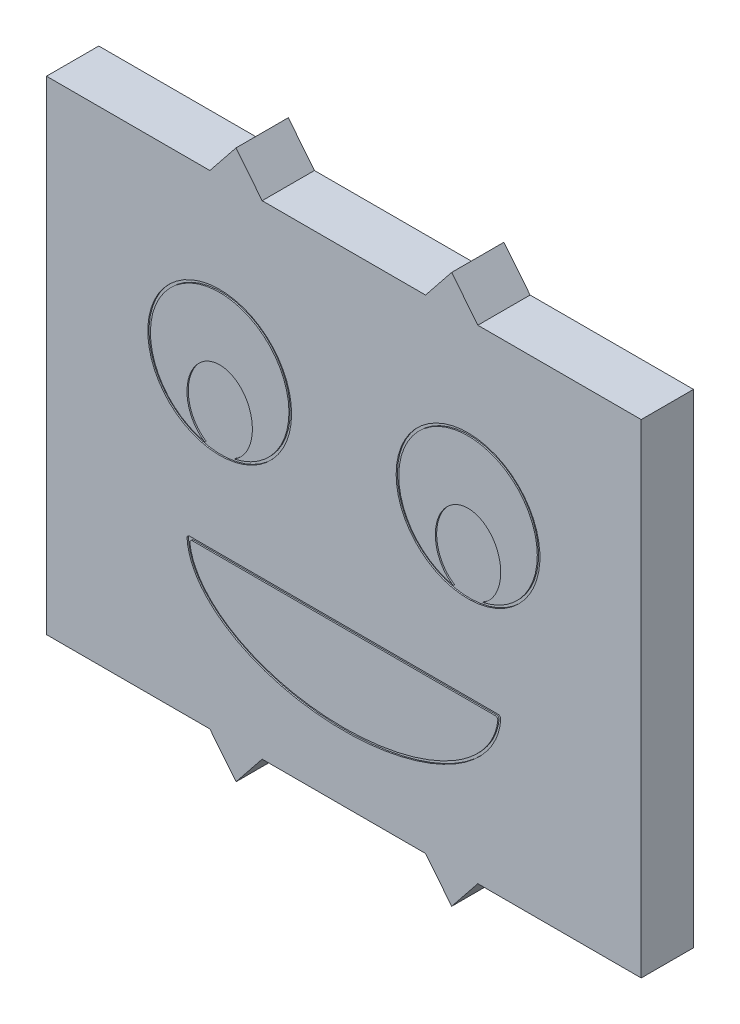
ISO-10303-21;
HEADER;
FILE_DESCRIPTION(('STEP AP214'),'2;1');
FILE_NAME('part.step','',(''),(''),'','','');
FILE_SCHEMA(('AUTOMOTIVE_DESIGN { 1 0 10303 214 1 1 1 1 }'));
ENDSEC;
DATA;
#1=APPLICATION_CONTEXT('core data for automotive mechanical design processes');
#2=APPLICATION_PROTOCOL_DEFINITION('international standard','automotive_design',2000,#1);
#3=PRODUCT_CONTEXT('',#1,'mechanical');
#4=PRODUCT('Part','Part','',(#3));
#5=PRODUCT_RELATED_PRODUCT_CATEGORY('part','',(#4));
#6=PRODUCT_DEFINITION_FORMATION('','',#4);
#7=PRODUCT_DEFINITION_CONTEXT('part definition',#1,'design');
#8=PRODUCT_DEFINITION('design','',#6,#7);
#9=PRODUCT_DEFINITION_SHAPE('','',#8);
#10=(LENGTH_UNIT() NAMED_UNIT(*) SI_UNIT(.MILLI.,.METRE.));
#11=(NAMED_UNIT(*) PLANE_ANGLE_UNIT() SI_UNIT($,.RADIAN.));
#12=(NAMED_UNIT(*) SI_UNIT($,.STERADIAN.) SOLID_ANGLE_UNIT());
#13=UNCERTAINTY_MEASURE_WITH_UNIT(LENGTH_MEASURE(1.E-05),#10,'distance_accuracy_value','');
#14=(GEOMETRIC_REPRESENTATION_CONTEXT(3) GLOBAL_UNCERTAINTY_ASSIGNED_CONTEXT((#13)) GLOBAL_UNIT_ASSIGNED_CONTEXT((#10,
#11,#12)) REPRESENTATION_CONTEXT('',''));
#15=CARTESIAN_POINT('',(0.,0.,0.));
#16=DIRECTION('',(0.,0.,1.));
#17=DIRECTION('',(1.,0.,0.));
#18=AXIS2_PLACEMENT_3D('',#15,#16,#17);
#19=CARTESIAN_POINT('',(0.,0.,4.));
#20=DIRECTION('',(0.,0.,1.));
#21=DIRECTION('',(1.,0.,0.));
#22=AXIS2_PLACEMENT_3D('',#19,#20,#21);
#23=PLANE('',#22);
#24=CARTESIAN_POINT('',(32.25,24.,4.));
#25=DIRECTION('',(0.,0.,-1.));
#26=DIRECTION('',(-1.,0.,0.));
#27=AXIS2_PLACEMENT_3D('',#24,#25,#26);
#28=CIRCLE('',#27,5.5);
#29=CARTESIAN_POINT('',(26.75,24.,4.));
#30=VERTEX_POINT('',#29);
#31=EDGE_CURVE('E250',#30,#30,#28,.T.);
#32=ORIENTED_EDGE('',*,*,#31,.T.);
#33=EDGE_LOOP('',(#32));
#34=FACE_BOUND('',#33,.T.);
#35=CARTESIAN_POINT('',(13.25,24.,4.));
#36=DIRECTION('',(0.,0.,1.));
#37=DIRECTION('',(1.,0.,0.));
#38=AXIS2_PLACEMENT_3D('',#35,#36,#37);
#39=CIRCLE('',#38,5.5);
#40=CARTESIAN_POINT('',(18.75,24.,4.));
#41=VERTEX_POINT('',#40);
#42=EDGE_CURVE('E275',#41,#41,#39,.T.);
#43=ORIENTED_EDGE('',*,*,#42,.F.);
#44=EDGE_LOOP('',(#43));
#45=FACE_BOUND('',#44,.T.);
#46=DIRECTION('',(1.,0.,0.));
#47=VECTOR('',#46,1.);
#48=CARTESIAN_POINT('',(0.,0.,4.));
#49=LINE('',#48,#47);
#50=CARTESIAN_POINT('',(0.,0.,4.));
#51=VERTEX_POINT('',#50);
#52=CARTESIAN_POINT('',(12.5,0.,4.));
#53=VERTEX_POINT('',#52);
#54=EDGE_CURVE('E346',#51,#53,#49,.T.);
#55=ORIENTED_EDGE('',*,*,#54,.T.);
#56=DIRECTION('',(0.624695047554424,-0.78086880944303,0.));
#57=VECTOR('',#56,1.);
#58=CARTESIAN_POINT('',(7.6219512195122,6.09756097560976,4.));
#59=LINE('',#58,#57);
#60=CARTESIAN_POINT('',(14.5,-2.5,4.));
#61=VERTEX_POINT('',#60);
#62=EDGE_CURVE('E353',#53,#61,#59,.T.);
#63=ORIENTED_EDGE('',*,*,#62,.T.);
#64=DIRECTION('',(0.624695047554424,0.780868809443031,0.));
#65=VECTOR('',#64,1.);
#66=CARTESIAN_POINT('',(10.0609756097561,-8.04878048780488,4.));
#67=LINE('',#66,#65);
#68=CARTESIAN_POINT('',(16.5,0.,4.));
#69=VERTEX_POINT('',#68);
#70=EDGE_CURVE('E359',#61,#69,#67,.T.);
#71=ORIENTED_EDGE('',*,*,#70,.T.);
#72=CARTESIAN_POINT('',(29.,0.,4.));
#73=VERTEX_POINT('',#72);
#74=EDGE_CURVE('E356',#69,#73,#49,.T.);
#75=ORIENTED_EDGE('',*,*,#74,.T.);
#76=DIRECTION('',(-0.624695047554424,0.78086880944303,0.));
#77=VECTOR('',#76,1.);
#78=CARTESIAN_POINT('',(17.6829268292683,14.1463414634146,4.));
#79=LINE('',#78,#77);
#80=CARTESIAN_POINT('',(31.,-2.5,4.));
#81=VERTEX_POINT('',#80);
#82=EDGE_CURVE('E362',#81,#73,#79,.T.);
#83=ORIENTED_EDGE('',*,*,#82,.F.);
#84=DIRECTION('',(-0.624695047554424,-0.78086880944303,0.));
#85=VECTOR('',#84,1.);
#86=CARTESIAN_POINT('',(20.1219512195122,-16.0975609756098,4.));
#87=LINE('',#86,#85);
#88=CARTESIAN_POINT('',(33.,0.,4.));
#89=VERTEX_POINT('',#88);
#90=EDGE_CURVE('E366',#89,#81,#87,.T.);
#91=ORIENTED_EDGE('',*,*,#90,.F.);
#92=CARTESIAN_POINT('',(45.5,0.,4.));
#93=VERTEX_POINT('',#92);
#94=EDGE_CURVE('E355',#89,#93,#49,.T.);
#95=ORIENTED_EDGE('',*,*,#94,.T.);
#96=DIRECTION('',(0.,1.,0.));
#97=VECTOR('',#96,1.);
#98=CARTESIAN_POINT('',(45.5,0.,4.));
#99=LINE('',#98,#97);
#100=CARTESIAN_POINT('',(45.5,37.,4.));
#101=VERTEX_POINT('',#100);
#102=EDGE_CURVE('E370',#93,#101,#99,.T.);
#103=ORIENTED_EDGE('',*,*,#102,.T.);
#104=DIRECTION('',(1.,0.,0.));
#105=VECTOR('',#104,1.);
#106=CARTESIAN_POINT('',(0.,37.,4.));
#107=LINE('',#106,#105);
#108=CARTESIAN_POINT('',(33.,37.,4.));
#109=VERTEX_POINT('',#108);
#110=EDGE_CURVE('E373',#109,#101,#107,.T.);
#111=ORIENTED_EDGE('',*,*,#110,.F.);
#112=DIRECTION('',(-0.624695047554424,0.78086880944303,0.));
#113=VECTOR('',#112,1.);
#114=CARTESIAN_POINT('',(38.1707317073171,30.5365853658537,4.));
#115=LINE('',#114,#113);
#116=CARTESIAN_POINT('',(31.,39.5,4.));
#117=VERTEX_POINT('',#116);
#118=EDGE_CURVE('E377',#109,#117,#115,.T.);
#119=ORIENTED_EDGE('',*,*,#118,.T.);
#120=DIRECTION('',(-0.624695047554424,-0.78086880944303,0.));
#121=VECTOR('',#120,1.);
#122=CARTESIAN_POINT('',(-0.365853658536584,0.292682926829267,4.));
#123=LINE('',#122,#121);
#124=CARTESIAN_POINT('',(29.,37.,4.));
#125=VERTEX_POINT('',#124);
#126=EDGE_CURVE('E382',#117,#125,#123,.T.);
#127=ORIENTED_EDGE('',*,*,#126,.T.);
#128=CARTESIAN_POINT('',(16.5,37.,4.));
#129=VERTEX_POINT('',#128);
#130=EDGE_CURVE('E379',#129,#125,#107,.T.);
#131=ORIENTED_EDGE('',*,*,#130,.F.);
#132=DIRECTION('',(0.624695047554424,-0.78086880944303,0.));
#133=VECTOR('',#132,1.);
#134=CARTESIAN_POINT('',(28.109756097561,22.4878048780488,4.));
#135=LINE('',#134,#133);
#136=CARTESIAN_POINT('',(14.5,39.5,4.));
#137=VERTEX_POINT('',#136);
#138=EDGE_CURVE('E385',#137,#129,#135,.T.);
#139=ORIENTED_EDGE('',*,*,#138,.F.);
#140=DIRECTION('',(0.624695047554424,0.780868809443031,0.));
#141=VECTOR('',#140,1.);
#142=CARTESIAN_POINT('',(-10.4268292682927,8.34146341463413,4.));
#143=LINE('',#142,#141);
#144=CARTESIAN_POINT('',(12.5,37.,4.));
#145=VERTEX_POINT('',#144);
#146=EDGE_CURVE('E389',#145,#137,#143,.T.);
#147=ORIENTED_EDGE('',*,*,#146,.F.);
#148=CARTESIAN_POINT('',(0.,37.,4.));
#149=VERTEX_POINT('',#148);
#150=EDGE_CURVE('E378',#149,#145,#107,.T.);
#151=ORIENTED_EDGE('',*,*,#150,.F.);
#152=DIRECTION('',(0.,1.,0.));
#153=VECTOR('',#152,1.);
#154=CARTESIAN_POINT('',(0.,0.,4.));
#155=LINE('',#154,#153);
#156=EDGE_CURVE('E393',#51,#149,#155,.T.);
#157=ORIENTED_EDGE('',*,*,#156,.F.);
#158=EDGE_LOOP('',(#55,#63,#71,#75,#83,#91,#95,#103,#111,#119,#127,#131,#139,#147,#151,#157));
#159=FACE_BOUND('',#158,.T.);
#160=CARTESIAN_POINT('',(22.75,12.,4.));
#161=DIRECTION('',(0.,0.,1.));
#162=DIRECTION('',(1.,0.,0.));
#163=AXIS2_PLACEMENT_3D('',#160,#161,#162);
#164=ELLIPSE('',#163,12.,7.);
#165=CARTESIAN_POINT('',(10.7554161966522,11.7897090336044,4.));
#166=VERTEX_POINT('',#165);
#167=CARTESIAN_POINT('',(34.7445838033478,11.7897090336044,4.));
#168=VERTEX_POINT('',#167);
#169=EDGE_CURVE('E331',#166,#168,#164,.T.);
#170=ORIENTED_EDGE('',*,*,#169,.F.);
#171=CARTESIAN_POINT('',(10.9551512612018,11.8,4.));
#172=DIRECTION('',(0.,0.,1.));
#173=DIRECTION('',(1.,0.,0.));
#174=AXIS2_PLACEMENT_3D('',#171,#172,#173);
#175=CIRCLE('',#174,0.2);
#176=CARTESIAN_POINT('',(10.9551512612018,12.,4.));
#177=VERTEX_POINT('',#176);
#178=EDGE_CURVE('E12',#166,#177,#175,.F.);
#179=ORIENTED_EDGE('',*,*,#178,.T.);
#180=DIRECTION('',(1.,0.,0.));
#181=VECTOR('',#180,1.);
#182=CARTESIAN_POINT('',(0.,12.,4.));
#183=LINE('',#182,#181);
#184=CARTESIAN_POINT('',(34.5448487387982,12.,4.));
#185=VERTEX_POINT('',#184);
#186=EDGE_CURVE('E324',#177,#185,#183,.T.);
#187=ORIENTED_EDGE('',*,*,#186,.T.);
#188=CARTESIAN_POINT('',(34.5448487387982,11.8,4.));
#189=DIRECTION('',(0.,0.,1.));
#190=DIRECTION('',(1.,0.,0.));
#191=AXIS2_PLACEMENT_3D('',#188,#189,#190);
#192=CIRCLE('',#191,0.2);
#193=EDGE_CURVE('E538',#185,#168,#192,.F.);
#194=ORIENTED_EDGE('',*,*,#193,.T.);
#195=EDGE_LOOP('',(#170,#179,#187,#194));
#196=FACE_BOUND('',#195,.T.);
#197=ADVANCED_FACE('F53',(#34,#45,#159,#196),#23,.T.);
#198=CARTESIAN_POINT('',(0.,0.,4.));
#199=DIRECTION('',(0.,1.,0.));
#200=DIRECTION('',(0.,0.,1.));
#201=AXIS2_PLACEMENT_3D('',#198,#199,#200);
#202=PLANE('',#201);
#203=DIRECTION('',(1.,0.,0.));
#204=VECTOR('',#203,1.);
#205=CARTESIAN_POINT('',(0.,0.,0.));
#206=LINE('',#205,#204);
#207=CARTESIAN_POINT('',(0.,0.,0.));
#208=VERTEX_POINT('',#207);
#209=CARTESIAN_POINT('',(12.5,0.,0.));
#210=VERTEX_POINT('',#209);
#211=EDGE_CURVE('E321',#208,#210,#206,.T.);
#212=ORIENTED_EDGE('',*,*,#211,.T.);
#213=DIRECTION('',(0.,0.,-1.));
#214=VECTOR('',#213,1.);
#215=CARTESIAN_POINT('',(12.5,0.,4.));
#216=LINE('',#215,#214);
#217=EDGE_CURVE('E493',#53,#210,#216,.T.);
#218=ORIENTED_EDGE('',*,*,#217,.F.);
#219=ORIENTED_EDGE('',*,*,#54,.F.);
#220=DIRECTION('',(0.,0.,-1.));
#221=VECTOR('',#220,1.);
#222=CARTESIAN_POINT('',(0.,0.,4.));
#223=LINE('',#222,#221);
#224=EDGE_CURVE('E397',#51,#208,#223,.T.);
#225=ORIENTED_EDGE('',*,*,#224,.T.);
#226=EDGE_LOOP('',(#212,#218,#219,#225));
#227=FACE_BOUND('',#226,.T.);
#228=ADVANCED_FACE('F575',(#227),#202,.F.);
#229=CARTESIAN_POINT('',(7.6219512195122,6.09756097560976,4.));
#230=DIRECTION('',(0.78086880944303,0.624695047554424,0.));
#231=DIRECTION('',(-0.624695047554424,0.78086880944303,0.));
#232=AXIS2_PLACEMENT_3D('',#229,#230,#231);
#233=PLANE('',#232);
#234=DIRECTION('',(0.624695047554424,-0.78086880944303,0.));
#235=VECTOR('',#234,1.);
#236=CARTESIAN_POINT('',(7.6219512195122,6.09756097560976,0.));
#237=LINE('',#236,#235);
#238=CARTESIAN_POINT('',(14.5,-2.5,0.));
#239=VERTEX_POINT('',#238);
#240=EDGE_CURVE('E401',#210,#239,#237,.T.);
#241=ORIENTED_EDGE('',*,*,#240,.T.);
#242=DIRECTION('',(0.,0.,-1.));
#243=VECTOR('',#242,1.);
#244=CARTESIAN_POINT('',(14.5,-2.5,4.));
#245=LINE('',#244,#243);
#246=EDGE_CURVE('E489',#61,#239,#245,.T.);
#247=ORIENTED_EDGE('',*,*,#246,.F.);
#248=ORIENTED_EDGE('',*,*,#62,.F.);
#249=ORIENTED_EDGE('',*,*,#217,.T.);
#250=EDGE_LOOP('',(#241,#247,#248,#249));
#251=FACE_BOUND('',#250,.T.);
#252=ADVANCED_FACE('F580',(#251),#233,.F.);
#253=CARTESIAN_POINT('',(10.0609756097561,-8.04878048780488,4.));
#254=DIRECTION('',(-0.780868809443031,0.624695047554424,0.));
#255=DIRECTION('',(-0.624695047554424,-0.780868809443031,0.));
#256=AXIS2_PLACEMENT_3D('',#253,#254,#255);
#257=PLANE('',#256);
#258=DIRECTION('',(0.624695047554424,0.780868809443031,0.));
#259=VECTOR('',#258,1.);
#260=CARTESIAN_POINT('',(10.0609756097561,-8.04878048780488,0.));
#261=LINE('',#260,#259);
#262=CARTESIAN_POINT('',(16.5,0.,0.));
#263=VERTEX_POINT('',#262);
#264=EDGE_CURVE('E406',#239,#263,#261,.T.);
#265=ORIENTED_EDGE('',*,*,#264,.T.);
#266=DIRECTION('',(0.,0.,-1.));
#267=VECTOR('',#266,1.);
#268=CARTESIAN_POINT('',(16.5,0.,4.));
#269=LINE('',#268,#267);
#270=EDGE_CURVE('E485',#69,#263,#269,.T.);
#271=ORIENTED_EDGE('',*,*,#270,.F.);
#272=ORIENTED_EDGE('',*,*,#70,.F.);
#273=ORIENTED_EDGE('',*,*,#246,.T.);
#274=EDGE_LOOP('',(#265,#271,#272,#273));
#275=FACE_BOUND('',#274,.T.);
#276=ADVANCED_FACE('F646',(#275),#257,.F.);
#277=CARTESIAN_POINT('',(29.,0.,0.));
#278=VERTEX_POINT('',#277);
#279=EDGE_CURVE('E403',#263,#278,#206,.T.);
#280=ORIENTED_EDGE('',*,*,#279,.T.);
#281=DIRECTION('',(0.,0.,-1.));
#282=VECTOR('',#281,1.);
#283=CARTESIAN_POINT('',(29.,0.,4.));
#284=LINE('',#283,#282);
#285=EDGE_CURVE('E482',#73,#278,#284,.T.);
#286=ORIENTED_EDGE('',*,*,#285,.F.);
#287=ORIENTED_EDGE('',*,*,#74,.F.);
#288=ORIENTED_EDGE('',*,*,#270,.T.);
#289=EDGE_LOOP('',(#280,#286,#287,#288));
#290=FACE_BOUND('',#289,.T.);
#291=ADVANCED_FACE('F583',(#290),#202,.F.);
#292=CARTESIAN_POINT('',(17.6829268292683,14.1463414634146,4.));
#293=DIRECTION('',(-0.78086880944303,-0.624695047554424,0.));
#294=DIRECTION('',(0.624695047554424,-0.78086880944303,0.));
#295=AXIS2_PLACEMENT_3D('',#292,#293,#294);
#296=PLANE('',#295);
#297=DIRECTION('',(-0.624695047554424,0.78086880944303,0.));
#298=VECTOR('',#297,1.);
#299=CARTESIAN_POINT('',(17.6829268292683,14.1463414634146,0.));
#300=LINE('',#299,#298);
#301=CARTESIAN_POINT('',(31.,-2.5,0.));
#302=VERTEX_POINT('',#301);
#303=EDGE_CURVE('E409',#302,#278,#300,.T.);
#304=ORIENTED_EDGE('',*,*,#303,.F.);
#305=DIRECTION('',(0.,0.,-1.));
#306=VECTOR('',#305,1.);
#307=CARTESIAN_POINT('',(31.,-2.5,4.));
#308=LINE('',#307,#306);
#309=EDGE_CURVE('E479',#81,#302,#308,.T.);
#310=ORIENTED_EDGE('',*,*,#309,.F.);
#311=ORIENTED_EDGE('',*,*,#82,.T.);
#312=ORIENTED_EDGE('',*,*,#285,.T.);
#313=EDGE_LOOP('',(#304,#310,#311,#312));
#314=FACE_BOUND('',#313,.T.);
#315=ADVANCED_FACE('F692',(#314),#296,.T.);
#316=CARTESIAN_POINT('',(20.1219512195122,-16.0975609756098,4.));
#317=DIRECTION('',(0.78086880944303,-0.624695047554424,0.));
#318=DIRECTION('',(0.624695047554424,0.78086880944303,0.));
#319=AXIS2_PLACEMENT_3D('',#316,#317,#318);
#320=PLANE('',#319);
#321=DIRECTION('',(-0.624695047554424,-0.78086880944303,0.));
#322=VECTOR('',#321,1.);
#323=CARTESIAN_POINT('',(20.1219512195122,-16.0975609756098,0.));
#324=LINE('',#323,#322);
#325=CARTESIAN_POINT('',(33.,0.,0.));
#326=VERTEX_POINT('',#325);
#327=EDGE_CURVE('E413',#326,#302,#324,.T.);
#328=ORIENTED_EDGE('',*,*,#327,.F.);
#329=DIRECTION('',(0.,0.,-1.));
#330=VECTOR('',#329,1.);
#331=CARTESIAN_POINT('',(33.,0.,4.));
#332=LINE('',#331,#330);
#333=EDGE_CURVE('E476',#89,#326,#332,.T.);
#334=ORIENTED_EDGE('',*,*,#333,.F.);
#335=ORIENTED_EDGE('',*,*,#90,.T.);
#336=ORIENTED_EDGE('',*,*,#309,.T.);
#337=EDGE_LOOP('',(#328,#334,#335,#336));
#338=FACE_BOUND('',#337,.T.);
#339=ADVANCED_FACE('F656',(#338),#320,.T.);
#340=CARTESIAN_POINT('',(45.5,0.,0.));
#341=VERTEX_POINT('',#340);
#342=EDGE_CURVE('E402',#326,#341,#206,.T.);
#343=ORIENTED_EDGE('',*,*,#342,.T.);
#344=DIRECTION('',(0.,0.,-1.));
#345=VECTOR('',#344,1.);
#346=CARTESIAN_POINT('',(45.5,0.,4.));
#347=LINE('',#346,#345);
#348=EDGE_CURVE('E472',#93,#341,#347,.T.);
#349=ORIENTED_EDGE('',*,*,#348,.F.);
#350=ORIENTED_EDGE('',*,*,#94,.F.);
#351=ORIENTED_EDGE('',*,*,#333,.T.);
#352=EDGE_LOOP('',(#343,#349,#350,#351));
#353=FACE_BOUND('',#352,.T.);
#354=ADVANCED_FACE('F584',(#353),#202,.F.);
#355=CARTESIAN_POINT('',(45.5,0.,4.));
#356=DIRECTION('',(-1.,0.,0.));
#357=DIRECTION('',(0.,0.,1.));
#358=AXIS2_PLACEMENT_3D('',#355,#356,#357);
#359=PLANE('',#358);
#360=DIRECTION('',(0.,1.,0.));
#361=VECTOR('',#360,1.);
#362=CARTESIAN_POINT('',(45.5,0.,0.));
#363=LINE('',#362,#361);
#364=CARTESIAN_POINT('',(45.5,37.,0.));
#365=VERTEX_POINT('',#364);
#366=EDGE_CURVE('E417',#341,#365,#363,.T.);
#367=ORIENTED_EDGE('',*,*,#366,.T.);
#368=DIRECTION('',(0.,0.,-1.));
#369=VECTOR('',#368,1.);
#370=CARTESIAN_POINT('',(45.5,37.,4.));
#371=LINE('',#370,#369);
#372=EDGE_CURVE('E469',#101,#365,#371,.T.);
#373=ORIENTED_EDGE('',*,*,#372,.F.);
#374=ORIENTED_EDGE('',*,*,#102,.F.);
#375=ORIENTED_EDGE('',*,*,#348,.T.);
#376=EDGE_LOOP('',(#367,#373,#374,#375));
#377=FACE_BOUND('',#376,.T.);
#378=ADVANCED_FACE('F666',(#377),#359,.F.);
#379=CARTESIAN_POINT('',(0.,37.,4.));
#380=DIRECTION('',(0.,1.,0.));
#381=DIRECTION('',(-1.,0.,0.));
#382=AXIS2_PLACEMENT_3D('',#379,#380,#381);
#383=PLANE('',#382);
#384=DIRECTION('',(1.,0.,0.));
#385=VECTOR('',#384,1.);
#386=CARTESIAN_POINT('',(0.,37.,0.));
#387=LINE('',#386,#385);
#388=CARTESIAN_POINT('',(33.,37.,0.));
#389=VERTEX_POINT('',#388);
#390=EDGE_CURVE('E421',#389,#365,#387,.T.);
#391=ORIENTED_EDGE('',*,*,#390,.F.);
#392=DIRECTION('',(0.,0.,-1.));
#393=VECTOR('',#392,1.);
#394=CARTESIAN_POINT('',(33.,37.,4.));
#395=LINE('',#394,#393);
#396=EDGE_CURVE('E466',#109,#389,#395,.T.);
#397=ORIENTED_EDGE('',*,*,#396,.F.);
#398=ORIENTED_EDGE('',*,*,#110,.T.);
#399=ORIENTED_EDGE('',*,*,#372,.T.);
#400=EDGE_LOOP('',(#391,#397,#398,#399));
#401=FACE_BOUND('',#400,.T.);
#402=ADVANCED_FACE('F670',(#401),#383,.T.);
#403=CARTESIAN_POINT('',(38.1707317073171,30.5365853658537,4.));
#404=DIRECTION('',(-0.78086880944303,-0.624695047554424,0.));
#405=DIRECTION('',(0.624695047554424,-0.78086880944303,0.));
#406=AXIS2_PLACEMENT_3D('',#403,#404,#405);
#407=PLANE('',#406);
#408=DIRECTION('',(-0.624695047554424,0.78086880944303,0.));
#409=VECTOR('',#408,1.);
#410=CARTESIAN_POINT('',(38.1707317073171,30.5365853658537,0.));
#411=LINE('',#410,#409);
#412=CARTESIAN_POINT('',(31.,39.5,0.));
#413=VERTEX_POINT('',#412);
#414=EDGE_CURVE('E425',#389,#413,#411,.T.);
#415=ORIENTED_EDGE('',*,*,#414,.T.);
#416=DIRECTION('',(0.,0.,-1.));
#417=VECTOR('',#416,1.);
#418=CARTESIAN_POINT('',(31.,39.5,4.));
#419=LINE('',#418,#417);
#420=EDGE_CURVE('E462',#117,#413,#419,.T.);
#421=ORIENTED_EDGE('',*,*,#420,.F.);
#422=ORIENTED_EDGE('',*,*,#118,.F.);
#423=ORIENTED_EDGE('',*,*,#396,.T.);
#424=EDGE_LOOP('',(#415,#421,#422,#423));
#425=FACE_BOUND('',#424,.T.);
#426=ADVANCED_FACE('F675',(#425),#407,.F.);
#427=CARTESIAN_POINT('',(-0.365853658536584,0.292682926829267,4.));
#428=DIRECTION('',(0.78086880944303,-0.624695047554424,0.));
#429=DIRECTION('',(0.624695047554424,0.78086880944303,0.));
#430=AXIS2_PLACEMENT_3D('',#427,#428,#429);
#431=PLANE('',#430);
#432=DIRECTION('',(-0.624695047554424,-0.78086880944303,0.));
#433=VECTOR('',#432,1.);
#434=CARTESIAN_POINT('',(-0.365853658536584,0.292682926829267,0.));
#435=LINE('',#434,#433);
#436=CARTESIAN_POINT('',(29.,37.,0.));
#437=VERTEX_POINT('',#436);
#438=EDGE_CURVE('E430',#413,#437,#435,.T.);
#439=ORIENTED_EDGE('',*,*,#438,.T.);
#440=DIRECTION('',(0.,0.,-1.));
#441=VECTOR('',#440,1.);
#442=CARTESIAN_POINT('',(29.,37.,4.));
#443=LINE('',#442,#441);
#444=EDGE_CURVE('E459',#125,#437,#443,.T.);
#445=ORIENTED_EDGE('',*,*,#444,.F.);
#446=ORIENTED_EDGE('',*,*,#126,.F.);
#447=ORIENTED_EDGE('',*,*,#420,.T.);
#448=EDGE_LOOP('',(#439,#445,#446,#447));
#449=FACE_BOUND('',#448,.T.);
#450=ADVANCED_FACE('F680',(#449),#431,.F.);
#451=CARTESIAN_POINT('',(16.5,37.,0.));
#452=VERTEX_POINT('',#451);
#453=EDGE_CURVE('E427',#452,#437,#387,.T.);
#454=ORIENTED_EDGE('',*,*,#453,.F.);
#455=DIRECTION('',(0.,0.,-1.));
#456=VECTOR('',#455,1.);
#457=CARTESIAN_POINT('',(16.5,37.,4.));
#458=LINE('',#457,#456);
#459=EDGE_CURVE('E456',#129,#452,#458,.T.);
#460=ORIENTED_EDGE('',*,*,#459,.F.);
#461=ORIENTED_EDGE('',*,*,#130,.T.);
#462=ORIENTED_EDGE('',*,*,#444,.T.);
#463=EDGE_LOOP('',(#454,#460,#461,#462));
#464=FACE_BOUND('',#463,.T.);
#465=ADVANCED_FACE('F684',(#464),#383,.T.);
#466=CARTESIAN_POINT('',(28.109756097561,22.4878048780488,4.));
#467=DIRECTION('',(0.78086880944303,0.624695047554424,0.));
#468=DIRECTION('',(-0.624695047554424,0.78086880944303,0.));
#469=AXIS2_PLACEMENT_3D('',#466,#467,#468);
#470=PLANE('',#469);
#471=DIRECTION('',(0.624695047554424,-0.78086880944303,0.));
#472=VECTOR('',#471,1.);
#473=CARTESIAN_POINT('',(28.109756097561,22.4878048780488,0.));
#474=LINE('',#473,#472);
#475=CARTESIAN_POINT('',(14.5,39.5,0.));
#476=VERTEX_POINT('',#475);
#477=EDGE_CURVE('E434',#476,#452,#474,.T.);
#478=ORIENTED_EDGE('',*,*,#477,.F.);
#479=DIRECTION('',(0.,0.,-1.));
#480=VECTOR('',#479,1.);
#481=CARTESIAN_POINT('',(14.5,39.5,4.));
#482=LINE('',#481,#480);
#483=EDGE_CURVE('E453',#137,#476,#482,.T.);
#484=ORIENTED_EDGE('',*,*,#483,.F.);
#485=ORIENTED_EDGE('',*,*,#138,.T.);
#486=ORIENTED_EDGE('',*,*,#459,.T.);
#487=EDGE_LOOP('',(#478,#484,#485,#486));
#488=FACE_BOUND('',#487,.T.);
#489=ADVANCED_FACE('F687',(#488),#470,.T.);
#490=CARTESIAN_POINT('',(-10.4268292682927,8.34146341463413,4.));
#491=DIRECTION('',(-0.780868809443031,0.624695047554424,0.));
#492=DIRECTION('',(-0.624695047554424,-0.780868809443031,0.));
#493=AXIS2_PLACEMENT_3D('',#490,#491,#492);
#494=PLANE('',#493);
#495=DIRECTION('',(0.624695047554424,0.780868809443031,0.));
#496=VECTOR('',#495,1.);
#497=CARTESIAN_POINT('',(-10.4268292682927,8.34146341463413,0.));
#498=LINE('',#497,#496);
#499=CARTESIAN_POINT('',(12.5,37.,0.));
#500=VERTEX_POINT('',#499);
#501=EDGE_CURVE('E438',#500,#476,#498,.T.);
#502=ORIENTED_EDGE('',*,*,#501,.F.);
#503=DIRECTION('',(0.,0.,-1.));
#504=VECTOR('',#503,1.);
#505=CARTESIAN_POINT('',(12.5,37.,4.));
#506=LINE('',#505,#504);
#507=EDGE_CURVE('E450',#145,#500,#506,.T.);
#508=ORIENTED_EDGE('',*,*,#507,.F.);
#509=ORIENTED_EDGE('',*,*,#146,.T.);
#510=ORIENTED_EDGE('',*,*,#483,.T.);
#511=EDGE_LOOP('',(#502,#508,#509,#510));
#512=FACE_BOUND('',#511,.T.);
#513=ADVANCED_FACE('F689',(#512),#494,.T.);
#514=CARTESIAN_POINT('',(0.,37.,0.));
#515=VERTEX_POINT('',#514);
#516=EDGE_CURVE('E426',#515,#500,#387,.T.);
#517=ORIENTED_EDGE('',*,*,#516,.F.);
#518=DIRECTION('',(0.,0.,-1.));
#519=VECTOR('',#518,1.);
#520=CARTESIAN_POINT('',(0.,37.,4.));
#521=LINE('',#520,#519);
#522=EDGE_CURVE('E447',#149,#515,#521,.T.);
#523=ORIENTED_EDGE('',*,*,#522,.F.);
#524=ORIENTED_EDGE('',*,*,#150,.T.);
#525=ORIENTED_EDGE('',*,*,#507,.T.);
#526=EDGE_LOOP('',(#517,#523,#524,#525));
#527=FACE_BOUND('',#526,.T.);
#528=ADVANCED_FACE('F627',(#527),#383,.T.);
#529=CARTESIAN_POINT('',(0.,0.,4.));
#530=DIRECTION('',(-1.,0.,0.));
#531=DIRECTION('',(0.,0.,1.));
#532=AXIS2_PLACEMENT_3D('',#529,#530,#531);
#533=PLANE('',#532);
#534=DIRECTION('',(0.,1.,0.));
#535=VECTOR('',#534,1.);
#536=CARTESIAN_POINT('',(0.,0.,0.));
#537=LINE('',#536,#535);
#538=EDGE_CURVE('E354',#208,#515,#537,.T.);
#539=ORIENTED_EDGE('',*,*,#538,.F.);
#540=ORIENTED_EDGE('',*,*,#224,.F.);
#541=ORIENTED_EDGE('',*,*,#156,.T.);
#542=ORIENTED_EDGE('',*,*,#522,.T.);
#543=EDGE_LOOP('',(#539,#540,#541,#542));
#544=FACE_BOUND('',#543,.T.);
#545=ADVANCED_FACE('F636',(#544),#533,.T.);
#546=CARTESIAN_POINT('',(0.,0.,0.));
#547=DIRECTION('',(0.,0.,1.));
#548=DIRECTION('',(1.,0.,0.));
#549=AXIS2_PLACEMENT_3D('',#546,#547,#548);
#550=PLANE('',#549);
#551=ORIENTED_EDGE('',*,*,#211,.F.);
#552=ORIENTED_EDGE('',*,*,#538,.T.);
#553=ORIENTED_EDGE('',*,*,#516,.T.);
#554=ORIENTED_EDGE('',*,*,#501,.T.);
#555=ORIENTED_EDGE('',*,*,#477,.T.);
#556=ORIENTED_EDGE('',*,*,#453,.T.);
#557=ORIENTED_EDGE('',*,*,#438,.F.);
#558=ORIENTED_EDGE('',*,*,#414,.F.);
#559=ORIENTED_EDGE('',*,*,#390,.T.);
#560=ORIENTED_EDGE('',*,*,#366,.F.);
#561=ORIENTED_EDGE('',*,*,#342,.F.);
#562=ORIENTED_EDGE('',*,*,#327,.T.);
#563=ORIENTED_EDGE('',*,*,#303,.T.);
#564=ORIENTED_EDGE('',*,*,#279,.F.);
#565=ORIENTED_EDGE('',*,*,#264,.F.);
#566=ORIENTED_EDGE('',*,*,#240,.F.);
#567=EDGE_LOOP('',(#551,#552,#553,#554,#555,#556,#557,#558,#559,#560,#561,#562,#563,#564,#565,#566));
#568=FACE_BOUND('',#567,.T.);
#569=ADVANCED_FACE('F691',(#568),#550,.F.);
#570=CARTESIAN_POINT('',(0.,11.8,3.9));
#571=DIRECTION('',(0.,-1.,0.));
#572=DIRECTION('',(1.,0.,0.));
#573=AXIS2_PLACEMENT_3D('',#570,#571,#572);
#574=PLANE('',#573);
#575=DIRECTION('',(1.,0.,0.));
#576=VECTOR('',#575,1.);
#577=CARTESIAN_POINT('',(0.,11.8,4.));
#578=LINE('',#577,#576);
#579=CARTESIAN_POINT('',(11.1716051015242,11.8,4.));
#580=VERTEX_POINT('',#579);
#581=CARTESIAN_POINT('',(34.3283948984758,11.8,4.));
#582=VERTEX_POINT('',#581);
#583=EDGE_CURVE('E335',#580,#582,#578,.T.);
#584=ORIENTED_EDGE('',*,*,#583,.T.);
#585=DIRECTION('',(0.,0.,1.));
#586=VECTOR('',#585,1.);
#587=CARTESIAN_POINT('',(34.3283948984758,11.8,3.9));
#588=LINE('',#587,#586);
#589=CARTESIAN_POINT('',(34.3283948984758,11.8,3.9));
#590=VERTEX_POINT('',#589);
#591=EDGE_CURVE('E514',#582,#590,#588,.F.);
#592=ORIENTED_EDGE('',*,*,#591,.T.);
#593=DIRECTION('',(1.,0.,0.));
#594=VECTOR('',#593,1.);
#595=CARTESIAN_POINT('',(0.,11.8,3.9));
#596=LINE('',#595,#594);
#597=CARTESIAN_POINT('',(11.1716051015242,11.8,3.9));
#598=VERTEX_POINT('',#597);
#599=EDGE_CURVE('E322',#598,#590,#596,.T.);
#600=ORIENTED_EDGE('',*,*,#599,.F.);
#601=DIRECTION('',(0.,0.,1.));
#602=VECTOR('',#601,1.);
#603=CARTESIAN_POINT('',(11.1716051015242,11.8,3.9));
#604=LINE('',#603,#602);
#605=EDGE_CURVE('E510',#598,#580,#604,.T.);
#606=ORIENTED_EDGE('',*,*,#605,.T.);
#607=EDGE_LOOP('',(#584,#592,#600,#606));
#608=FACE_BOUND('',#607,.T.);
#609=ADVANCED_FACE('F311',(#608),#574,.F.);
#610=CARTESIAN_POINT('',(0.,12.,3.9));
#611=DIRECTION('',(0.,-1.,0.));
#612=DIRECTION('',(1.,0.,0.));
#613=AXIS2_PLACEMENT_3D('',#610,#611,#612);
#614=PLANE('',#613);
#615=DIRECTION('',(1.,0.,0.));
#616=VECTOR('',#615,1.);
#617=CARTESIAN_POINT('',(0.,12.,3.9));
#618=LINE('',#617,#616);
#619=CARTESIAN_POINT('',(10.9551512612018,12.,3.9));
#620=VERTEX_POINT('',#619);
#621=CARTESIAN_POINT('',(34.5448487387982,12.,3.9));
#622=VERTEX_POINT('',#621);
#623=EDGE_CURVE('E345',#620,#622,#618,.T.);
#624=ORIENTED_EDGE('',*,*,#623,.T.);
#625=DIRECTION('',(0.,0.,1.));
#626=VECTOR('',#625,1.);
#627=CARTESIAN_POINT('',(34.5448487387982,12.,3.9));
#628=LINE('',#627,#626);
#629=EDGE_CURVE('E520',#622,#185,#628,.T.);
#630=ORIENTED_EDGE('',*,*,#629,.T.);
#631=ORIENTED_EDGE('',*,*,#186,.F.);
#632=DIRECTION('',(0.,0.,1.));
#633=VECTOR('',#632,1.);
#634=CARTESIAN_POINT('',(10.9551512612018,12.,3.9));
#635=LINE('',#634,#633);
#636=EDGE_CURVE('E517',#177,#620,#635,.F.);
#637=ORIENTED_EDGE('',*,*,#636,.T.);
#638=EDGE_LOOP('',(#624,#630,#631,#637));
#639=FACE_BOUND('',#638,.T.);
#640=ADVANCED_FACE('F904',(#639),#614,.T.);
#641=CARTESIAN_POINT('',(22.75,12.,3.9));
#642=DIRECTION('',(0.,0.,1.));
#643=DIRECTION('',(1.,0.,0.));
#644=AXIS2_PLACEMENT_3D('',#641,#642,#643);
#645=ELLIPSE('',#644,12.,7.);
#646=DIRECTION('',(0.,0.,1.));
#647=VECTOR('',#646,1.);
#648=SURFACE_OF_LINEAR_EXTRUSION('',#645,#647);
#649=ORIENTED_EDGE('',*,*,#169,.T.);
#650=DIRECTION('',(0.,0.,1.));
#651=VECTOR('',#650,1.);
#652=CARTESIAN_POINT('',(34.7445838033478,11.7897090336044,4.));
#653=LINE('',#652,#651);
#654=CARTESIAN_POINT('',(34.7445838033478,11.7897090336044,3.9));
#655=VERTEX_POINT('',#654);
#656=EDGE_CURVE('E69',#168,#655,#653,.F.);
#657=ORIENTED_EDGE('',*,*,#656,.T.);
#658=CARTESIAN_POINT('',(10.7554161966522,11.7897090336044,3.9));
#659=VERTEX_POINT('',#658);
#660=EDGE_CURVE('E554',#659,#655,#645,.T.);
#661=ORIENTED_EDGE('',*,*,#660,.F.);
#662=DIRECTION('',(0.,0.,1.));
#663=VECTOR('',#662,1.);
#664=CARTESIAN_POINT('',(10.7554161966522,11.7897090336044,3.9));
#665=LINE('',#664,#663);
#666=EDGE_CURVE('E524',#659,#166,#665,.T.);
#667=ORIENTED_EDGE('',*,*,#666,.T.);
#668=EDGE_LOOP('',(#649,#657,#661,#667));
#669=FACE_BOUND('',#668,.T.);
#670=ADVANCED_FACE('F309',(#669),#648,.F.);
#671=CARTESIAN_POINT('',(34.5448487387982,11.8,3.9));
#672=CARTESIAN_POINT('',(34.522497461647,11.3661890620422,3.9));
#673=CARTESIAN_POINT('',(34.3376199424287,10.5227920275558,3.9));
#674=CARTESIAN_POINT('',(33.4058252676987,8.86747076149444,3.9));
#675=CARTESIAN_POINT('',(31.2200980226987,7.03024196579888,3.9));
#676=CARTESIAN_POINT('',(27.3266215332922,5.54713345510025,3.9));
#677=CARTESIAN_POINT('',(22.75,5.02643327244987,3.9));
#678=CARTESIAN_POINT('',(18.1733784667078,5.54713345510025,3.9));
#679=CARTESIAN_POINT('',(14.2799019773013,7.03024196579888,3.9));
#680=CARTESIAN_POINT('',(12.0941747323013,8.86747076149444,3.9));
#681=CARTESIAN_POINT('',(11.1623800575713,10.5227920275558,3.9));
#682=CARTESIAN_POINT('',(10.977502538353,11.3661890620422,3.9));
#683=CARTESIAN_POINT('',(10.9551512612018,11.8,3.9));
#684=B_SPLINE_CURVE_WITH_KNOTS('',3,(#671,#672,#673,#674,#675,#676,#677,#678,#679,#680,#681,
#682,#683),.UNSPECIFIED.,.F.,.F.,(4,1,1,1,1,1,1,1,1,1,4),(3.17163874078479,3.36423252073478,
3.55682630068476,3.94201386058474,4.32720142048471,4.71238898038469,5.09757654028467,
5.48276410018464,5.86795166008462,6.0605454400346,6.25313921998459),.UNSPECIFIED.);
#685=DIRECTION('',(0.,0.,1.));
#686=VECTOR('',#685,1.);
#687=SURFACE_OF_LINEAR_EXTRUSION('',#684,#686);
#688=CARTESIAN_POINT('',(34.5272442793833,11.5785774951813,3.9));
#689=VERTEX_POINT('',#688);
#690=CARTESIAN_POINT('',(10.9727557206167,11.5785774951813,3.9));
#691=VERTEX_POINT('',#690);
#692=EDGE_CURVE('E313',#689,#691,#684,.T.);
#693=ORIENTED_EDGE('',*,*,#692,.F.);
#694=DIRECTION('',(0.,0.,1.));
#695=VECTOR('',#694,1.);
#696=CARTESIAN_POINT('',(34.5272442793833,11.5785774951813,3.9));
#697=LINE('',#696,#695);
#698=CARTESIAN_POINT('',(34.5272442793833,11.5785774951813,4.));
#699=VERTEX_POINT('',#698);
#700=EDGE_CURVE('E500',#689,#699,#697,.T.);
#701=ORIENTED_EDGE('',*,*,#700,.T.);
#702=CARTESIAN_POINT('',(34.5448487387982,11.8,4.));
#703=CARTESIAN_POINT('',(34.522497461647,11.3661890620422,4.));
#704=CARTESIAN_POINT('',(34.3376199424287,10.5227920275558,4.));
#705=CARTESIAN_POINT('',(33.4058252676987,8.86747076149444,4.));
#706=CARTESIAN_POINT('',(31.2200980226987,7.03024196579888,4.));
#707=CARTESIAN_POINT('',(27.3266215332922,5.54713345510025,4.));
#708=CARTESIAN_POINT('',(22.75,5.02643327244987,4.));
#709=CARTESIAN_POINT('',(18.1733784667078,5.54713345510025,4.));
#710=CARTESIAN_POINT('',(14.2799019773013,7.03024196579888,4.));
#711=CARTESIAN_POINT('',(12.0941747323013,8.86747076149444,4.));
#712=CARTESIAN_POINT('',(11.1623800575713,10.5227920275558,4.));
#713=CARTESIAN_POINT('',(10.977502538353,11.3661890620422,4.));
#714=CARTESIAN_POINT('',(10.9551512612018,11.8,4.));
#715=B_SPLINE_CURVE_WITH_KNOTS('',3,(#702,#703,#704,#705,#706,#707,#708,#709,#710,#711,#712,
#713,#714),.UNSPECIFIED.,.F.,.F.,(4,1,1,1,1,1,1,1,1,1,4),(3.17163874078479,3.36423252073478,
3.55682630068476,3.94201386058474,4.32720142048471,4.71238898038469,5.09757654028467,
5.48276410018464,5.86795166008462,6.0605454400346,6.25313921998459),.UNSPECIFIED.);
#716=CARTESIAN_POINT('',(10.9727557206167,11.5785774951813,4.));
#717=VERTEX_POINT('',#716);
#718=EDGE_CURVE('E339',#699,#717,#715,.T.);
#719=ORIENTED_EDGE('',*,*,#718,.T.);
#720=DIRECTION('',(0.,0.,1.));
#721=VECTOR('',#720,1.);
#722=CARTESIAN_POINT('',(10.9727557206167,11.5785774951813,4.));
#723=LINE('',#722,#721);
#724=EDGE_CURVE('E497',#717,#691,#723,.F.);
#725=ORIENTED_EDGE('',*,*,#724,.T.);
#726=EDGE_LOOP('',(#693,#701,#719,#725));
#727=FACE_BOUND('',#726,.T.);
#728=ADVANCED_FACE('F305',(#727),#687,.F.);
#729=CARTESIAN_POINT('',(0.,0.,3.9));
#730=DIRECTION('',(0.,0.,1.));
#731=DIRECTION('',(1.,0.,0.));
#732=AXIS2_PLACEMENT_3D('',#729,#730,#731);
#733=PLANE('',#732);
#734=ORIENTED_EDGE('',*,*,#660,.T.);
#735=CARTESIAN_POINT('',(34.5448487387982,11.8,3.9));
#736=DIRECTION('',(0.,0.,1.));
#737=DIRECTION('',(1.,0.,0.));
#738=AXIS2_PLACEMENT_3D('',#735,#736,#737);
#739=CIRCLE('',#738,0.2);
#740=EDGE_CURVE('E532',#655,#622,#739,.T.);
#741=ORIENTED_EDGE('',*,*,#740,.T.);
#742=ORIENTED_EDGE('',*,*,#623,.F.);
#743=CARTESIAN_POINT('',(10.9551512612018,11.8,3.9));
#744=DIRECTION('',(0.,0.,1.));
#745=DIRECTION('',(1.,0.,0.));
#746=AXIS2_PLACEMENT_3D('',#743,#744,#745);
#747=CIRCLE('',#746,0.2);
#748=EDGE_CURVE('E76',#620,#659,#747,.T.);
#749=ORIENTED_EDGE('',*,*,#748,.T.);
#750=EDGE_LOOP('',(#734,#741,#742,#749));
#751=FACE_BOUND('',#750,.T.);
#752=ORIENTED_EDGE('',*,*,#692,.T.);
#753=CARTESIAN_POINT('',(11.1716051015242,11.6,3.9));
#754=DIRECTION('',(0.,0.,1.));
#755=DIRECTION('',(1.,0.,0.));
#756=AXIS2_PLACEMENT_3D('',#753,#754,#755);
#757=CIRCLE('',#756,0.2);
#758=EDGE_CURVE('E62',#691,#598,#757,.F.);
#759=ORIENTED_EDGE('',*,*,#758,.T.);
#760=ORIENTED_EDGE('',*,*,#599,.T.);
#761=CARTESIAN_POINT('',(34.3283948984758,11.6,3.9));
#762=DIRECTION('',(0.,0.,1.));
#763=DIRECTION('',(1.,0.,0.));
#764=AXIS2_PLACEMENT_3D('',#761,#762,#763);
#765=CIRCLE('',#764,0.2);
#766=EDGE_CURVE('E535',#590,#689,#765,.F.);
#767=ORIENTED_EDGE('',*,*,#766,.T.);
#768=EDGE_LOOP('',(#752,#759,#760,#767));
#769=FACE_BOUND('',#768,.T.);
#770=ADVANCED_FACE('F301',(#751,#769),#733,.T.);
#771=ORIENTED_EDGE('',*,*,#718,.F.);
#772=CARTESIAN_POINT('',(34.3283948984758,11.6,4.));
#773=DIRECTION('',(0.,0.,1.));
#774=DIRECTION('',(1.,0.,0.));
#775=AXIS2_PLACEMENT_3D('',#772,#773,#774);
#776=CIRCLE('',#775,0.2);
#777=EDGE_CURVE('E507',#699,#582,#776,.T.);
#778=ORIENTED_EDGE('',*,*,#777,.T.);
#779=ORIENTED_EDGE('',*,*,#583,.F.);
#780=CARTESIAN_POINT('',(11.1716051015242,11.6,4.));
#781=DIRECTION('',(0.,0.,1.));
#782=DIRECTION('',(1.,0.,0.));
#783=AXIS2_PLACEMENT_3D('',#780,#781,#782);
#784=CIRCLE('',#783,0.2);
#785=EDGE_CURVE('E504',#580,#717,#784,.T.);
#786=ORIENTED_EDGE('',*,*,#785,.T.);
#787=EDGE_LOOP('',(#771,#778,#779,#786));
#788=FACE_BOUND('',#787,.T.);
#789=ADVANCED_FACE('F304',(#788),#23,.T.);
#790=CARTESIAN_POINT('',(13.25,24.,3.9));
#791=DIRECTION('',(0.,0.,1.));
#792=DIRECTION('',(1.,0.,0.));
#793=AXIS2_PLACEMENT_3D('',#790,#791,#792);
#794=CYLINDRICAL_SURFACE('',#793,5.3);
#795=DIRECTION('',(0.,0.,1.));
#796=VECTOR('',#795,1.);
#797=CARTESIAN_POINT('',(14.3746394716417,18.8206963731767,3.9));
#798=LINE('',#797,#796);
#799=CARTESIAN_POINT('',(14.3746394716417,18.8206963731767,3.9));
#800=VERTEX_POINT('',#799);
#801=CARTESIAN_POINT('',(14.3746394716417,18.8206963731767,4.));
#802=VERTEX_POINT('',#801);
#803=EDGE_CURVE('E290',#800,#802,#798,.T.);
#804=ORIENTED_EDGE('',*,*,#803,.F.);
#805=CARTESIAN_POINT('',(13.25,24.,3.9));
#806=DIRECTION('',(0.,0.,1.));
#807=DIRECTION('',(1.,0.,0.));
#808=AXIS2_PLACEMENT_3D('',#805,#806,#807);
#809=CIRCLE('',#808,5.3);
#810=CARTESIAN_POINT('',(12.1253605283583,18.8206963731767,3.9));
#811=VERTEX_POINT('',#810);
#812=EDGE_CURVE('E269',#800,#811,#809,.T.);
#813=ORIENTED_EDGE('',*,*,#812,.T.);
#814=DIRECTION('',(0.,0.,1.));
#815=VECTOR('',#814,1.);
#816=CARTESIAN_POINT('',(12.1253605283583,18.8206963731767,3.9));
#817=LINE('',#816,#815);
#818=CARTESIAN_POINT('',(12.1253605283583,18.8206963731767,4.));
#819=VERTEX_POINT('',#818);
#820=EDGE_CURVE('E332',#811,#819,#817,.T.);
#821=ORIENTED_EDGE('',*,*,#820,.T.);
#822=CARTESIAN_POINT('',(13.25,24.,4.));
#823=DIRECTION('',(0.,0.,1.));
#824=DIRECTION('',(1.,0.,0.));
#825=AXIS2_PLACEMENT_3D('',#822,#823,#824);
#826=CIRCLE('',#825,5.3);
#827=EDGE_CURVE('E264',#802,#819,#826,.T.);
#828=ORIENTED_EDGE('',*,*,#827,.F.);
#829=EDGE_LOOP('',(#804,#813,#821,#828));
#830=FACE_BOUND('',#829,.T.);
#831=ADVANCED_FACE('F590',(#830),#794,.T.);
#832=CARTESIAN_POINT('',(13.25,24.,3.9));
#833=DIRECTION('',(0.,0.,1.));
#834=DIRECTION('',(1.,0.,0.));
#835=AXIS2_PLACEMENT_3D('',#832,#833,#834);
#836=CYLINDRICAL_SURFACE('',#835,5.5);
#837=CARTESIAN_POINT('',(13.25,24.,3.9));
#838=DIRECTION('',(0.,0.,1.));
#839=DIRECTION('',(1.,0.,0.));
#840=AXIS2_PLACEMENT_3D('',#837,#838,#839);
#841=CIRCLE('',#840,5.5);
#842=CARTESIAN_POINT('',(18.75,24.,3.9));
#843=VERTEX_POINT('',#842);
#844=EDGE_CURVE('E277',#843,#843,#841,.T.);
#845=ORIENTED_EDGE('',*,*,#844,.F.);
#846=EDGE_LOOP('',(#845));
#847=FACE_BOUND('',#846,.T.);
#848=ORIENTED_EDGE('',*,*,#42,.T.);
#849=EDGE_LOOP('',(#848));
#850=FACE_BOUND('',#849,.T.);
#851=ADVANCED_FACE('F822',(#847,#850),#836,.F.);
#852=CARTESIAN_POINT('',(0.,0.,3.9));
#853=DIRECTION('',(0.,0.,1.));
#854=DIRECTION('',(1.,0.,0.));
#855=AXIS2_PLACEMENT_3D('',#852,#853,#854);
#856=PLANE('',#855);
#857=CARTESIAN_POINT('',(13.25,21.5,3.9));
#858=DIRECTION('',(0.,0.,1.));
#859=DIRECTION('',(0.,-1.,0.));
#860=AXIS2_PLACEMENT_3D('',#857,#858,#859);
#861=ELLIPSE('',#860,3.,2.5);
#862=EDGE_CURVE('E285',#800,#811,#861,.T.);
#863=ORIENTED_EDGE('',*,*,#862,.T.);
#864=ORIENTED_EDGE('',*,*,#812,.F.);
#865=EDGE_LOOP('',(#863,#864));
#866=FACE_BOUND('',#865,.T.);
#867=ORIENTED_EDGE('',*,*,#844,.T.);
#868=EDGE_LOOP('',(#867));
#869=FACE_BOUND('',#868,.T.);
#870=ADVANCED_FACE('F298',(#866,#869),#856,.T.);
#871=DIRECTION('',(0.,0.,1.));
#872=VECTOR('',#871,1.);
#873=SURFACE_OF_LINEAR_EXTRUSION('',#861,#872);
#874=CARTESIAN_POINT('',(13.25,21.5,4.));
#875=DIRECTION('',(0.,0.,1.));
#876=DIRECTION('',(0.,-1.,0.));
#877=AXIS2_PLACEMENT_3D('',#874,#875,#876);
#878=ELLIPSE('',#877,3.,2.5);
#879=EDGE_CURVE('E281',#802,#819,#878,.T.);
#880=ORIENTED_EDGE('',*,*,#879,.T.);
#881=ORIENTED_EDGE('',*,*,#820,.F.);
#882=ORIENTED_EDGE('',*,*,#862,.F.);
#883=ORIENTED_EDGE('',*,*,#803,.T.);
#884=EDGE_LOOP('',(#880,#881,#882,#883));
#885=FACE_BOUND('',#884,.T.);
#886=ADVANCED_FACE('F293',(#885),#873,.F.);
#887=ORIENTED_EDGE('',*,*,#879,.F.);
#888=ORIENTED_EDGE('',*,*,#827,.T.);
#889=EDGE_LOOP('',(#887,#888));
#890=FACE_BOUND('',#889,.T.);
#891=ADVANCED_FACE('F297',(#890),#23,.T.);
#892=CARTESIAN_POINT('',(32.25,24.,3.9));
#893=DIRECTION('',(0.,0.,1.));
#894=DIRECTION('',(1.,0.,0.));
#895=AXIS2_PLACEMENT_3D('',#892,#893,#894);
#896=CYLINDRICAL_SURFACE('',#895,5.5);
#897=CARTESIAN_POINT('',(32.25,24.,3.9));
#898=DIRECTION('',(0.,0.,-1.));
#899=DIRECTION('',(-1.,0.,0.));
#900=AXIS2_PLACEMENT_3D('',#897,#898,#899);
#901=CIRCLE('',#900,5.5);
#902=CARTESIAN_POINT('',(26.75,24.,3.9));
#903=VERTEX_POINT('',#902);
#904=EDGE_CURVE('E1019',#903,#903,#901,.T.);
#905=ORIENTED_EDGE('',*,*,#904,.T.);
#906=EDGE_LOOP('',(#905));
#907=FACE_BOUND('',#906,.T.);
#908=ORIENTED_EDGE('',*,*,#31,.F.);
#909=EDGE_LOOP('',(#908));
#910=FACE_BOUND('',#909,.T.);
#911=ADVANCED_FACE('F592',(#907,#910),#896,.F.);
#912=CARTESIAN_POINT('',(32.25,24.,3.9));
#913=DIRECTION('',(0.,0.,1.));
#914=DIRECTION('',(1.,0.,0.));
#915=AXIS2_PLACEMENT_3D('',#912,#913,#914);
#916=CYLINDRICAL_SURFACE('',#915,5.3);
#917=DIRECTION('',(0.,0.,1.));
#918=VECTOR('',#917,1.);
#919=CARTESIAN_POINT('',(33.3746394716417,18.8206963731767,3.9));
#920=LINE('',#919,#918);
#921=CARTESIAN_POINT('',(33.3746394716417,18.8206963731767,3.9));
#922=VERTEX_POINT('',#921);
#923=CARTESIAN_POINT('',(33.3746394716417,18.8206963731767,4.));
#924=VERTEX_POINT('',#923);
#925=EDGE_CURVE('E246',#922,#924,#920,.T.);
#926=ORIENTED_EDGE('',*,*,#925,.F.);
#927=CARTESIAN_POINT('',(32.25,24.,3.9));
#928=DIRECTION('',(0.,0.,-1.));
#929=DIRECTION('',(-1.,0.,0.));
#930=AXIS2_PLACEMENT_3D('',#927,#928,#929);
#931=CIRCLE('',#930,5.3);
#932=CARTESIAN_POINT('',(31.1253605283583,18.8206963731767,3.9));
#933=VERTEX_POINT('',#932);
#934=EDGE_CURVE('E239',#933,#922,#931,.T.);
#935=ORIENTED_EDGE('',*,*,#934,.F.);
#936=DIRECTION('',(0.,0.,1.));
#937=VECTOR('',#936,1.);
#938=CARTESIAN_POINT('',(31.1253605283583,18.8206963731767,3.9));
#939=LINE('',#938,#937);
#940=CARTESIAN_POINT('',(31.1253605283583,18.8206963731767,4.));
#941=VERTEX_POINT('',#940);
#942=EDGE_CURVE('E243',#933,#941,#939,.T.);
#943=ORIENTED_EDGE('',*,*,#942,.T.);
#944=CARTESIAN_POINT('',(32.25,24.,4.));
#945=DIRECTION('',(0.,0.,-1.));
#946=DIRECTION('',(-1.,0.,0.));
#947=AXIS2_PLACEMENT_3D('',#944,#945,#946);
#948=CIRCLE('',#947,5.3);
#949=EDGE_CURVE('E251',#941,#924,#948,.T.);
#950=ORIENTED_EDGE('',*,*,#949,.T.);
#951=EDGE_LOOP('',(#926,#935,#943,#950));
#952=FACE_BOUND('',#951,.T.);
#953=ADVANCED_FACE('F241',(#952),#916,.T.);
#954=CARTESIAN_POINT('',(45.5,0.,3.9));
#955=DIRECTION('',(0.,0.,1.));
#956=DIRECTION('',(-1.,0.,0.));
#957=AXIS2_PLACEMENT_3D('',#954,#955,#956);
#958=PLANE('',#957);
#959=CARTESIAN_POINT('',(32.25,21.5,3.9));
#960=DIRECTION('',(0.,0.,-1.));
#961=DIRECTION('',(0.,-1.,0.));
#962=AXIS2_PLACEMENT_3D('',#959,#960,#961);
#963=ELLIPSE('',#962,3.,2.5);
#964=EDGE_CURVE('E253',#933,#922,#963,.T.);
#965=ORIENTED_EDGE('',*,*,#964,.F.);
#966=ORIENTED_EDGE('',*,*,#934,.T.);
#967=EDGE_LOOP('',(#965,#966));
#968=FACE_BOUND('',#967,.T.);
#969=ORIENTED_EDGE('',*,*,#904,.F.);
#970=EDGE_LOOP('',(#969));
#971=FACE_BOUND('',#970,.T.);
#972=ADVANCED_FACE('F254',(#968,#971),#958,.T.);
#973=DIRECTION('',(0.,0.,1.));
#974=VECTOR('',#973,1.);
#975=SURFACE_OF_LINEAR_EXTRUSION('',#963,#974);
#976=CARTESIAN_POINT('',(32.25,21.5,4.));
#977=DIRECTION('',(0.,0.,-1.));
#978=DIRECTION('',(0.,-1.,0.));
#979=AXIS2_PLACEMENT_3D('',#976,#977,#978);
#980=ELLIPSE('',#979,3.,2.5);
#981=EDGE_CURVE('E258',#941,#924,#980,.T.);
#982=ORIENTED_EDGE('',*,*,#981,.F.);
#983=ORIENTED_EDGE('',*,*,#942,.F.);
#984=ORIENTED_EDGE('',*,*,#964,.T.);
#985=ORIENTED_EDGE('',*,*,#925,.T.);
#986=EDGE_LOOP('',(#982,#983,#984,#985));
#987=FACE_BOUND('',#986,.T.);
#988=ADVANCED_FACE('F261',(#987),#975,.T.);
#989=ORIENTED_EDGE('',*,*,#949,.F.);
#990=ORIENTED_EDGE('',*,*,#981,.T.);
#991=EDGE_LOOP('',(#989,#990));
#992=FACE_BOUND('',#991,.T.);
#993=ADVANCED_FACE('F563',(#992),#23,.T.);
#994=CARTESIAN_POINT('',(34.3283948984758,11.6,3.95));
#995=DIRECTION('',(0.,0.,1.));
#996=DIRECTION('',(1.,0.,0.));
#997=AXIS2_PLACEMENT_3D('',#994,#995,#996);
#998=CYLINDRICAL_SURFACE('',#997,0.2);
#999=ORIENTED_EDGE('',*,*,#766,.F.);
#1000=ORIENTED_EDGE('',*,*,#591,.F.);
#1001=ORIENTED_EDGE('',*,*,#777,.F.);
#1002=ORIENTED_EDGE('',*,*,#700,.F.);
#1003=EDGE_LOOP('',(#999,#1000,#1001,#1002));
#1004=FACE_BOUND('',#1003,.T.);
#1005=ADVANCED_FACE('F560',(#1004),#998,.T.);
#1006=CARTESIAN_POINT('',(34.5448487387982,11.8,3.95));
#1007=DIRECTION('',(0.,0.,1.));
#1008=DIRECTION('',(1.,0.,0.));
#1009=AXIS2_PLACEMENT_3D('',#1006,#1007,#1008);
#1010=CYLINDRICAL_SURFACE('',#1009,0.2);
#1011=ORIENTED_EDGE('',*,*,#740,.F.);
#1012=ORIENTED_EDGE('',*,*,#656,.F.);
#1013=ORIENTED_EDGE('',*,*,#193,.F.);
#1014=ORIENTED_EDGE('',*,*,#629,.F.);
#1015=EDGE_LOOP('',(#1011,#1012,#1013,#1014));
#1016=FACE_BOUND('',#1015,.T.);
#1017=ADVANCED_FACE('F562',(#1016),#1010,.F.);
#1018=CARTESIAN_POINT('',(11.1716051015242,11.6,3.95));
#1019=DIRECTION('',(0.,0.,1.));
#1020=DIRECTION('',(1.,0.,0.));
#1021=AXIS2_PLACEMENT_3D('',#1018,#1019,#1020);
#1022=CYLINDRICAL_SURFACE('',#1021,0.2);
#1023=ORIENTED_EDGE('',*,*,#758,.F.);
#1024=ORIENTED_EDGE('',*,*,#724,.F.);
#1025=ORIENTED_EDGE('',*,*,#785,.F.);
#1026=ORIENTED_EDGE('',*,*,#605,.F.);
#1027=EDGE_LOOP('',(#1023,#1024,#1025,#1026));
#1028=FACE_BOUND('',#1027,.T.);
#1029=ADVANCED_FACE('F555',(#1028),#1022,.T.);
#1030=CARTESIAN_POINT('',(10.9551512612018,11.8,3.95));
#1031=DIRECTION('',(0.,0.,1.));
#1032=DIRECTION('',(1.,0.,0.));
#1033=AXIS2_PLACEMENT_3D('',#1030,#1031,#1032);
#1034=CYLINDRICAL_SURFACE('',#1033,0.2);
#1035=ORIENTED_EDGE('',*,*,#748,.F.);
#1036=ORIENTED_EDGE('',*,*,#636,.F.);
#1037=ORIENTED_EDGE('',*,*,#178,.F.);
#1038=ORIENTED_EDGE('',*,*,#666,.F.);
#1039=EDGE_LOOP('',(#1035,#1036,#1037,#1038));
#1040=FACE_BOUND('',#1039,.T.);
#1041=ADVANCED_FACE('F55',(#1040),#1034,.F.);
#1042=CLOSED_SHELL('',(#197,#228,#252,#276,#291,#315,#339,#354,#378,#402,#426,#450,#465,#489,
#513,#528,#545,#569,#609,#640,#670,#728,#770,#789,#831,#851,#870,#886,#891,#911,#953,#972,#988,
#993,#1005,#1017,#1029,#1041));
#1043=MANIFOLD_SOLID_BREP('B2',#1042);
#1044=ADVANCED_BREP_SHAPE_REPRESENTATION('',(#18,#1043),#14);
#1045=SHAPE_DEFINITION_REPRESENTATION(#9,#1044);
ENDSEC;
END-ISO-10303-21;
